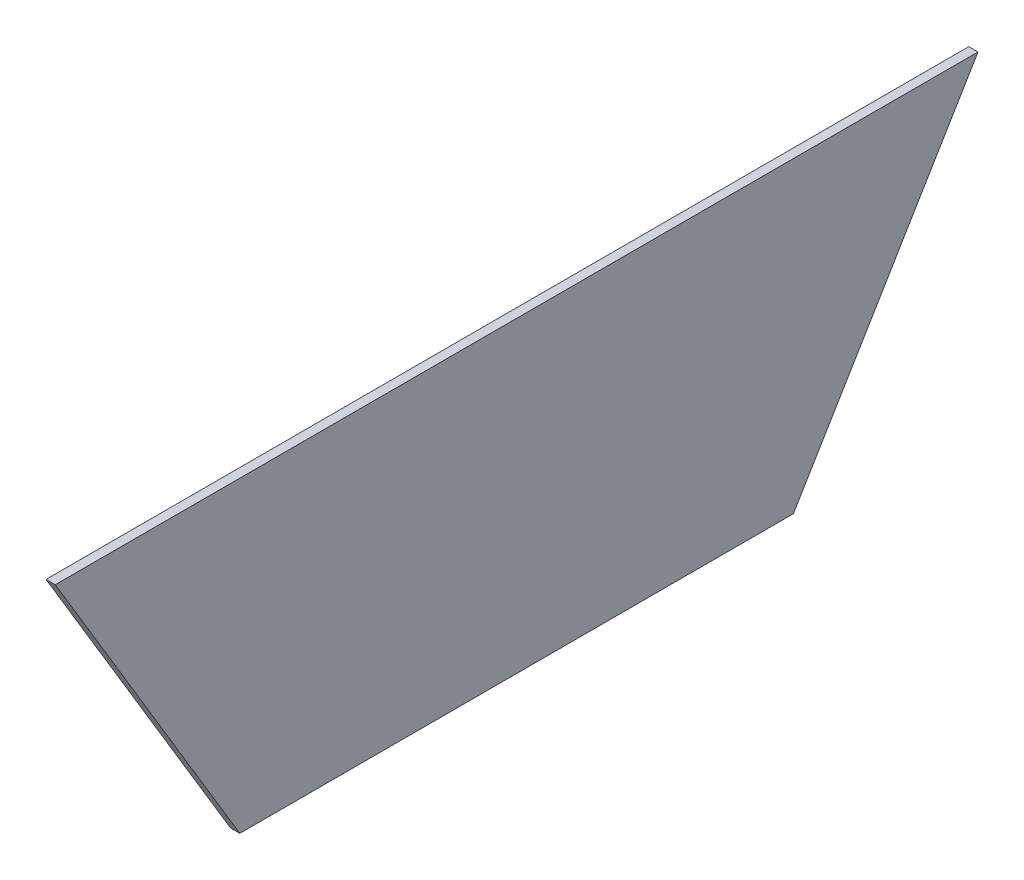
ISO-10303-21;
HEADER;
FILE_DESCRIPTION(('STEP AP214'),'2;1');
FILE_NAME('part.step','',(''),(''),'','','');
FILE_SCHEMA(('AUTOMOTIVE_DESIGN { 1 0 10303 214 1 1 1 1 }'));
ENDSEC;
DATA;
#1=APPLICATION_CONTEXT('core data for automotive mechanical design processes');
#2=APPLICATION_PROTOCOL_DEFINITION('international standard','automotive_design',2000,#1);
#3=PRODUCT_CONTEXT('',#1,'mechanical');
#4=PRODUCT('Part','Part','',(#3));
#5=PRODUCT_RELATED_PRODUCT_CATEGORY('part','',(#4));
#6=PRODUCT_DEFINITION_FORMATION('','',#4);
#7=PRODUCT_DEFINITION_CONTEXT('part definition',#1,'design');
#8=PRODUCT_DEFINITION('design','',#6,#7);
#9=PRODUCT_DEFINITION_SHAPE('','',#8);
#10=(LENGTH_UNIT() NAMED_UNIT(*) SI_UNIT(.MILLI.,.METRE.));
#11=(NAMED_UNIT(*) PLANE_ANGLE_UNIT() SI_UNIT($,.RADIAN.));
#12=(NAMED_UNIT(*) SI_UNIT($,.STERADIAN.) SOLID_ANGLE_UNIT());
#13=UNCERTAINTY_MEASURE_WITH_UNIT(LENGTH_MEASURE(1.E-05),#10,'distance_accuracy_value','');
#14=(GEOMETRIC_REPRESENTATION_CONTEXT(3) GLOBAL_UNCERTAINTY_ASSIGNED_CONTEXT((#13)) GLOBAL_UNIT_ASSIGNED_CONTEXT((#10,
#11,#12)) REPRESENTATION_CONTEXT('',''));
#15=CARTESIAN_POINT('',(0.,0.,0.));
#16=DIRECTION('',(0.,0.,1.));
#17=DIRECTION('',(1.,0.,0.));
#18=AXIS2_PLACEMENT_3D('',#15,#16,#17);
#19=CARTESIAN_POINT('',(-3.,100.,150.));
#20=DIRECTION('',(0.,-0.514495755427527,0.857492925712544));
#21=DIRECTION('',(0.,-0.857492925712544,-0.514495755427527));
#22=AXIS2_PLACEMENT_3D('',#19,#20,#21);
#23=PLANE('',#22);
#24=DIRECTION('',(0.,-0.857492925712544,-0.514495755427526));
#25=VECTOR('',#24,1.);
#26=CARTESIAN_POINT('',(0.,100.,150.));
#27=LINE('',#26,#25);
#28=CARTESIAN_POINT('',(0.,100.,150.));
#29=VERTEX_POINT('',#28);
#30=CARTESIAN_POINT('',(0.,0.,90.));
#31=VERTEX_POINT('',#30);
#32=EDGE_CURVE('E115',#29,#31,#27,.T.);
#33=ORIENTED_EDGE('',*,*,#32,.F.);
#34=DIRECTION('',(1.,0.,0.));
#35=VECTOR('',#34,1.);
#36=CARTESIAN_POINT('',(-3.,100.,150.));
#37=LINE('',#36,#35);
#38=CARTESIAN_POINT('',(-3.,100.,150.));
#39=VERTEX_POINT('',#38);
#40=EDGE_CURVE('E11',#39,#29,#37,.T.);
#41=ORIENTED_EDGE('',*,*,#40,.F.);
#42=DIRECTION('',(0.,-0.857492925712544,-0.514495755427526));
#43=VECTOR('',#42,1.);
#44=CARTESIAN_POINT('',(-3.,100.,150.));
#45=LINE('',#44,#43);
#46=CARTESIAN_POINT('',(-3.,0.,90.));
#47=VERTEX_POINT('',#46);
#48=EDGE_CURVE('E106',#39,#47,#45,.T.);
#49=ORIENTED_EDGE('',*,*,#48,.T.);
#50=DIRECTION('',(1.,0.,0.));
#51=VECTOR('',#50,1.);
#52=CARTESIAN_POINT('',(-3.,0.,90.));
#53=LINE('',#52,#51);
#54=EDGE_CURVE('E47',#47,#31,#53,.T.);
#55=ORIENTED_EDGE('',*,*,#54,.T.);
#56=EDGE_LOOP('',(#33,#41,#49,#55));
#57=FACE_BOUND('',#56,.T.);
#58=ADVANCED_FACE('F44',(#57),#23,.T.);
#59=CARTESIAN_POINT('',(-3.,100.,-150.));
#60=DIRECTION('',(0.,1.,0.));
#61=DIRECTION('',(0.,0.,1.));
#62=AXIS2_PLACEMENT_3D('',#59,#60,#61);
#63=PLANE('',#62);
#64=DIRECTION('',(0.,0.,1.));
#65=VECTOR('',#64,1.);
#66=CARTESIAN_POINT('',(0.,100.,-150.));
#67=LINE('',#66,#65);
#68=CARTESIAN_POINT('',(0.,100.,-150.));
#69=VERTEX_POINT('',#68);
#70=EDGE_CURVE('E110',#69,#29,#67,.T.);
#71=ORIENTED_EDGE('',*,*,#70,.F.);
#72=DIRECTION('',(1.,0.,0.));
#73=VECTOR('',#72,1.);
#74=CARTESIAN_POINT('',(-3.,100.,-150.));
#75=LINE('',#74,#73);
#76=CARTESIAN_POINT('',(-3.,100.,-150.));
#77=VERTEX_POINT('',#76);
#78=EDGE_CURVE('E54',#77,#69,#75,.T.);
#79=ORIENTED_EDGE('',*,*,#78,.F.);
#80=DIRECTION('',(0.,0.,1.));
#81=VECTOR('',#80,1.);
#82=CARTESIAN_POINT('',(-3.,100.,-150.));
#83=LINE('',#82,#81);
#84=EDGE_CURVE('E101',#77,#39,#83,.T.);
#85=ORIENTED_EDGE('',*,*,#84,.T.);
#86=ORIENTED_EDGE('',*,*,#40,.T.);
#87=EDGE_LOOP('',(#71,#79,#85,#86));
#88=FACE_BOUND('',#87,.T.);
#89=ADVANCED_FACE('F137',(#88),#63,.T.);
#90=CARTESIAN_POINT('',(-3.,0.,-90.));
#91=DIRECTION('',(0.,-0.514495755427526,-0.857492925712544));
#92=DIRECTION('',(0.,0.857492925712544,-0.514495755427526));
#93=AXIS2_PLACEMENT_3D('',#90,#91,#92);
#94=PLANE('',#93);
#95=DIRECTION('',(0.,0.857492925712544,-0.514495755427526));
#96=VECTOR('',#95,1.);
#97=CARTESIAN_POINT('',(0.,0.,-90.));
#98=LINE('',#97,#96);
#99=CARTESIAN_POINT('',(0.,0.,-90.));
#100=VERTEX_POINT('',#99);
#101=EDGE_CURVE('E95',#100,#69,#98,.T.);
#102=ORIENTED_EDGE('',*,*,#101,.F.);
#103=DIRECTION('',(1.,0.,0.));
#104=VECTOR('',#103,1.);
#105=CARTESIAN_POINT('',(-3.,0.,-90.));
#106=LINE('',#105,#104);
#107=CARTESIAN_POINT('',(-3.,0.,-90.));
#108=VERTEX_POINT('',#107);
#109=EDGE_CURVE('E90',#108,#100,#106,.T.);
#110=ORIENTED_EDGE('',*,*,#109,.F.);
#111=DIRECTION('',(0.,0.857492925712544,-0.514495755427526));
#112=VECTOR('',#111,1.);
#113=CARTESIAN_POINT('',(-3.,0.,-90.));
#114=LINE('',#113,#112);
#115=EDGE_CURVE('E93',#108,#77,#114,.T.);
#116=ORIENTED_EDGE('',*,*,#115,.T.);
#117=ORIENTED_EDGE('',*,*,#78,.T.);
#118=EDGE_LOOP('',(#102,#110,#116,#117));
#119=FACE_BOUND('',#118,.T.);
#120=ADVANCED_FACE('F92',(#119),#94,.T.);
#121=CARTESIAN_POINT('',(-3.,0.,90.));
#122=DIRECTION('',(0.,-1.,0.));
#123=DIRECTION('',(0.,0.,-1.));
#124=AXIS2_PLACEMENT_3D('',#121,#122,#123);
#125=PLANE('',#124);
#126=DIRECTION('',(0.,0.,-1.));
#127=VECTOR('',#126,1.);
#128=CARTESIAN_POINT('',(0.,0.,90.));
#129=LINE('',#128,#127);
#130=EDGE_CURVE('E119',#31,#100,#129,.T.);
#131=ORIENTED_EDGE('',*,*,#130,.F.);
#132=ORIENTED_EDGE('',*,*,#54,.F.);
#133=DIRECTION('',(0.,0.,-1.));
#134=VECTOR('',#133,1.);
#135=CARTESIAN_POINT('',(-3.,0.,90.));
#136=LINE('',#135,#134);
#137=EDGE_CURVE('E100',#47,#108,#136,.T.);
#138=ORIENTED_EDGE('',*,*,#137,.T.);
#139=ORIENTED_EDGE('',*,*,#109,.T.);
#140=EDGE_LOOP('',(#131,#132,#138,#139));
#141=FACE_BOUND('',#140,.T.);
#142=ADVANCED_FACE('F104',(#141),#125,.T.);
#143=CARTESIAN_POINT('',(-3.,0.,0.));
#144=DIRECTION('',(1.,0.,0.));
#145=DIRECTION('',(0.,0.,-1.));
#146=AXIS2_PLACEMENT_3D('',#143,#144,#145);
#147=PLANE('',#146);
#148=ORIENTED_EDGE('',*,*,#48,.F.);
#149=ORIENTED_EDGE('',*,*,#84,.F.);
#150=ORIENTED_EDGE('',*,*,#115,.F.);
#151=ORIENTED_EDGE('',*,*,#137,.F.);
#152=EDGE_LOOP('',(#148,#149,#150,#151));
#153=FACE_BOUND('',#152,.T.);
#154=ADVANCED_FACE('F99',(#153),#147,.F.);
#155=CARTESIAN_POINT('',(0.,0.,0.));
#156=DIRECTION('',(1.,0.,0.));
#157=DIRECTION('',(0.,0.,-1.));
#158=AXIS2_PLACEMENT_3D('',#155,#156,#157);
#159=PLANE('',#158);
#160=ORIENTED_EDGE('',*,*,#32,.T.);
#161=ORIENTED_EDGE('',*,*,#130,.T.);
#162=ORIENTED_EDGE('',*,*,#101,.T.);
#163=ORIENTED_EDGE('',*,*,#70,.T.);
#164=EDGE_LOOP('',(#160,#161,#162,#163));
#165=FACE_BOUND('',#164,.T.);
#166=ADVANCED_FACE('F136',(#165),#159,.T.);
#167=CLOSED_SHELL('',(#58,#89,#120,#142,#154,#166));
#168=MANIFOLD_SOLID_BREP('B2',#167);
#169=ADVANCED_BREP_SHAPE_REPRESENTATION('',(#18,#168),#14);
#170=SHAPE_DEFINITION_REPRESENTATION(#9,#169);
ENDSEC;
END-ISO-10303-21;
